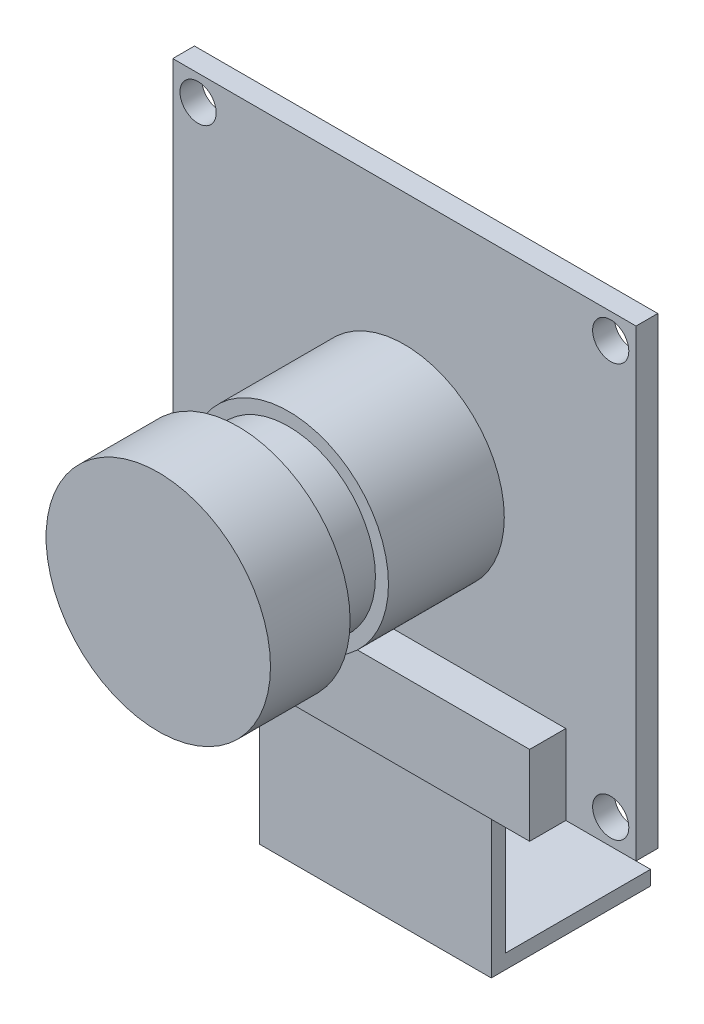
ISO-10303-21;
HEADER;
FILE_DESCRIPTION(('STEP AP214'),'2;1');
FILE_NAME('part.step','',(''),(''),'','','');
FILE_SCHEMA(('AUTOMOTIVE_DESIGN { 1 0 10303 214 1 1 1 1 }'));
ENDSEC;
DATA;
#1=APPLICATION_CONTEXT('core data for automotive mechanical design processes');
#2=APPLICATION_PROTOCOL_DEFINITION('international standard','automotive_design',2000,#1);
#3=PRODUCT_CONTEXT('',#1,'mechanical');
#4=PRODUCT('Part','Part','',(#3));
#5=PRODUCT_RELATED_PRODUCT_CATEGORY('part','',(#4));
#6=PRODUCT_DEFINITION_FORMATION('','',#4);
#7=PRODUCT_DEFINITION_CONTEXT('part definition',#1,'design');
#8=PRODUCT_DEFINITION('design','',#6,#7);
#9=PRODUCT_DEFINITION_SHAPE('','',#8);
#10=(LENGTH_UNIT() NAMED_UNIT(*) SI_UNIT(.MILLI.,.METRE.));
#11=(NAMED_UNIT(*) PLANE_ANGLE_UNIT() SI_UNIT($,.RADIAN.));
#12=(NAMED_UNIT(*) SI_UNIT($,.STERADIAN.) SOLID_ANGLE_UNIT());
#13=UNCERTAINTY_MEASURE_WITH_UNIT(LENGTH_MEASURE(1.E-05),#10,'distance_accuracy_value','');
#14=(GEOMETRIC_REPRESENTATION_CONTEXT(3) GLOBAL_UNCERTAINTY_ASSIGNED_CONTEXT((#13)) GLOBAL_UNIT_ASSIGNED_CONTEXT((#10,
#11,#12)) REPRESENTATION_CONTEXT('',''));
#15=CARTESIAN_POINT('',(0.,0.,0.));
#16=DIRECTION('',(0.,0.,1.));
#17=DIRECTION('',(1.,0.,0.));
#18=AXIS2_PLACEMENT_3D('',#15,#16,#17);
#19=CARTESIAN_POINT('',(0.,0.,1.5));
#20=DIRECTION('',(0.,0.,1.));
#21=DIRECTION('',(1.,0.,0.));
#22=AXIS2_PLACEMENT_3D('',#19,#20,#21);
#23=PLANE('',#22);
#24=CARTESIAN_POINT('',(0.,0.,1.5));
#25=DIRECTION('',(0.,0.,1.));
#26=DIRECTION('',(1.,0.,0.));
#27=AXIS2_PLACEMENT_3D('',#24,#25,#26);
#28=CIRCLE('',#27,6.9);
#29=CARTESIAN_POINT('',(6.9,0.,1.5));
#30=VERTEX_POINT('',#29);
#31=EDGE_CURVE('E229',#30,#30,#28,.T.);
#32=ORIENTED_EDGE('',*,*,#31,.F.);
#33=EDGE_LOOP('',(#32));
#34=FACE_BOUND('',#33,.T.);
#35=CARTESIAN_POINT('',(14.25,14.25,1.5));
#36=DIRECTION('',(0.,0.,1.));
#37=DIRECTION('',(1.,0.,0.));
#38=AXIS2_PLACEMENT_3D('',#35,#36,#37);
#39=CIRCLE('',#38,1.25);
#40=CARTESIAN_POINT('',(15.5,14.25,1.5));
#41=VERTEX_POINT('',#40);
#42=EDGE_CURVE('E282',#41,#41,#39,.T.);
#43=ORIENTED_EDGE('',*,*,#42,.F.);
#44=EDGE_LOOP('',(#43));
#45=FACE_BOUND('',#44,.T.);
#46=CARTESIAN_POINT('',(14.25,-14.25,1.5));
#47=DIRECTION('',(0.,0.,1.));
#48=DIRECTION('',(1.,0.,0.));
#49=AXIS2_PLACEMENT_3D('',#46,#47,#48);
#50=CIRCLE('',#49,1.25000000000003);
#51=CARTESIAN_POINT('',(15.5,-14.25,1.5));
#52=VERTEX_POINT('',#51);
#53=EDGE_CURVE('E285',#52,#52,#50,.T.);
#54=ORIENTED_EDGE('',*,*,#53,.F.);
#55=EDGE_LOOP('',(#54));
#56=FACE_BOUND('',#55,.T.);
#57=CARTESIAN_POINT('',(-14.25,-14.25,1.5));
#58=DIRECTION('',(0.,0.,1.));
#59=DIRECTION('',(1.,0.,0.));
#60=AXIS2_PLACEMENT_3D('',#57,#58,#59);
#61=CIRCLE('',#60,1.25000000000007);
#62=CARTESIAN_POINT('',(-12.9999999999999,-14.25,1.5));
#63=VERTEX_POINT('',#62);
#64=EDGE_CURVE('E288',#63,#63,#61,.T.);
#65=ORIENTED_EDGE('',*,*,#64,.F.);
#66=EDGE_LOOP('',(#65));
#67=FACE_BOUND('',#66,.T.);
#68=CARTESIAN_POINT('',(-14.25,14.25,1.5));
#69=DIRECTION('',(0.,0.,1.));
#70=DIRECTION('',(1.,0.,0.));
#71=AXIS2_PLACEMENT_3D('',#68,#69,#70);
#72=CIRCLE('',#71,1.2500000000001);
#73=CARTESIAN_POINT('',(-12.9999999999999,14.25,1.5));
#74=VERTEX_POINT('',#73);
#75=EDGE_CURVE('E291',#74,#74,#72,.T.);
#76=ORIENTED_EDGE('',*,*,#75,.F.);
#77=EDGE_LOOP('',(#76));
#78=FACE_BOUND('',#77,.T.);
#79=DIRECTION('',(1.,0.,0.));
#80=VECTOR('',#79,1.);
#81=CARTESIAN_POINT('',(0.,-16.,1.5));
#82=LINE('',#81,#80);
#83=CARTESIAN_POINT('',(-16.,-16.,1.5));
#84=VERTEX_POINT('',#83);
#85=CARTESIAN_POINT('',(-11.15,-16.,1.5));
#86=VERTEX_POINT('',#85);
#87=EDGE_CURVE('E274',#84,#86,#82,.T.);
#88=ORIENTED_EDGE('',*,*,#87,.T.);
#89=DIRECTION('',(0.,1.,0.));
#90=VECTOR('',#89,1.);
#91=CARTESIAN_POINT('',(-11.15,0.,1.5));
#92=LINE('',#91,#90);
#93=CARTESIAN_POINT('',(-11.15,-10.5,1.5));
#94=VERTEX_POINT('',#93);
#95=EDGE_CURVE('E236',#86,#94,#92,.T.);
#96=ORIENTED_EDGE('',*,*,#95,.T.);
#97=DIRECTION('',(-1.,0.,0.));
#98=VECTOR('',#97,1.);
#99=CARTESIAN_POINT('',(0.,-10.5,1.5));
#100=LINE('',#99,#98);
#101=CARTESIAN_POINT('',(11.15,-10.5,1.5));
#102=VERTEX_POINT('',#101);
#103=EDGE_CURVE('E252',#102,#94,#100,.T.);
#104=ORIENTED_EDGE('',*,*,#103,.F.);
#105=DIRECTION('',(0.,1.,0.));
#106=VECTOR('',#105,1.);
#107=CARTESIAN_POINT('',(11.15,0.,1.5));
#108=LINE('',#107,#106);
#109=CARTESIAN_POINT('',(11.15,-16.,1.5));
#110=VERTEX_POINT('',#109);
#111=EDGE_CURVE('E243',#110,#102,#108,.T.);
#112=ORIENTED_EDGE('',*,*,#111,.F.);
#113=CARTESIAN_POINT('',(16.,-16.,1.5));
#114=VERTEX_POINT('',#113);
#115=EDGE_CURVE('E272',#110,#114,#82,.T.);
#116=ORIENTED_EDGE('',*,*,#115,.T.);
#117=DIRECTION('',(0.,-1.,0.));
#118=VECTOR('',#117,1.);
#119=CARTESIAN_POINT('',(16.,0.,1.5));
#120=LINE('',#119,#118);
#121=CARTESIAN_POINT('',(16.,16.,1.5));
#122=VERTEX_POINT('',#121);
#123=EDGE_CURVE('E276',#122,#114,#120,.T.);
#124=ORIENTED_EDGE('',*,*,#123,.F.);
#125=DIRECTION('',(1.,0.,0.));
#126=VECTOR('',#125,1.);
#127=CARTESIAN_POINT('',(0.,16.,1.5));
#128=LINE('',#127,#126);
#129=CARTESIAN_POINT('',(-16.,16.,1.5));
#130=VERTEX_POINT('',#129);
#131=EDGE_CURVE('E279',#130,#122,#128,.T.);
#132=ORIENTED_EDGE('',*,*,#131,.F.);
#133=DIRECTION('',(0.,-1.,0.));
#134=VECTOR('',#133,1.);
#135=CARTESIAN_POINT('',(-16.,0.,1.5));
#136=LINE('',#135,#134);
#137=EDGE_CURVE('E269',#130,#84,#136,.T.);
#138=ORIENTED_EDGE('',*,*,#137,.T.);
#139=EDGE_LOOP('',(#88,#96,#104,#112,#116,#124,#132,#138));
#140=FACE_BOUND('',#139,.T.);
#141=ADVANCED_FACE('F56',(#34,#45,#56,#67,#78,#140),#23,.T.);
#142=CARTESIAN_POINT('',(-14.25,14.25,1.5));
#143=DIRECTION('',(0.,0.,-1.));
#144=DIRECTION('',(-1.,0.,0.));
#145=AXIS2_PLACEMENT_3D('',#142,#143,#144);
#146=CYLINDRICAL_SURFACE('',#145,1.2500000000001);
#147=ORIENTED_EDGE('',*,*,#75,.T.);
#148=EDGE_LOOP('',(#147));
#149=FACE_BOUND('',#148,.T.);
#150=CARTESIAN_POINT('',(-14.25,14.25,0.));
#151=DIRECTION('',(0.,0.,1.));
#152=DIRECTION('',(1.,0.,0.));
#153=AXIS2_PLACEMENT_3D('',#150,#151,#152);
#154=CIRCLE('',#153,1.2500000000001);
#155=CARTESIAN_POINT('',(-12.9999999999999,14.25,0.));
#156=VERTEX_POINT('',#155);
#157=EDGE_CURVE('E273',#156,#156,#154,.T.);
#158=ORIENTED_EDGE('',*,*,#157,.F.);
#159=EDGE_LOOP('',(#158));
#160=FACE_BOUND('',#159,.T.);
#161=ADVANCED_FACE('F368',(#149,#160),#146,.F.);
#162=CARTESIAN_POINT('',(-14.25,-14.25,1.5));
#163=DIRECTION('',(0.,0.,-1.));
#164=DIRECTION('',(-1.,0.,0.));
#165=AXIS2_PLACEMENT_3D('',#162,#163,#164);
#166=CYLINDRICAL_SURFACE('',#165,1.25000000000007);
#167=ORIENTED_EDGE('',*,*,#64,.T.);
#168=EDGE_LOOP('',(#167));
#169=FACE_BOUND('',#168,.T.);
#170=CARTESIAN_POINT('',(-14.25,-14.25,0.));
#171=DIRECTION('',(0.,0.,1.));
#172=DIRECTION('',(1.,0.,0.));
#173=AXIS2_PLACEMENT_3D('',#170,#171,#172);
#174=CIRCLE('',#173,1.25000000000007);
#175=CARTESIAN_POINT('',(-12.9999999999999,-14.25,0.));
#176=VERTEX_POINT('',#175);
#177=EDGE_CURVE('E312',#176,#176,#174,.T.);
#178=ORIENTED_EDGE('',*,*,#177,.F.);
#179=EDGE_LOOP('',(#178));
#180=FACE_BOUND('',#179,.T.);
#181=ADVANCED_FACE('F374',(#169,#180),#166,.F.);
#182=CARTESIAN_POINT('',(14.25,-14.25,1.5));
#183=DIRECTION('',(0.,0.,-1.));
#184=DIRECTION('',(-1.,0.,0.));
#185=AXIS2_PLACEMENT_3D('',#182,#183,#184);
#186=CYLINDRICAL_SURFACE('',#185,1.25000000000003);
#187=ORIENTED_EDGE('',*,*,#53,.T.);
#188=EDGE_LOOP('',(#187));
#189=FACE_BOUND('',#188,.T.);
#190=CARTESIAN_POINT('',(14.25,-14.25,0.));
#191=DIRECTION('',(0.,0.,1.));
#192=DIRECTION('',(1.,0.,0.));
#193=AXIS2_PLACEMENT_3D('',#190,#191,#192);
#194=CIRCLE('',#193,1.25000000000003);
#195=CARTESIAN_POINT('',(15.5,-14.25,0.));
#196=VERTEX_POINT('',#195);
#197=EDGE_CURVE('E309',#196,#196,#194,.T.);
#198=ORIENTED_EDGE('',*,*,#197,.F.);
#199=EDGE_LOOP('',(#198));
#200=FACE_BOUND('',#199,.T.);
#201=ADVANCED_FACE('F385',(#189,#200),#186,.F.);
#202=CARTESIAN_POINT('',(14.25,14.25,1.5));
#203=DIRECTION('',(0.,0.,-1.));
#204=DIRECTION('',(-1.,0.,0.));
#205=AXIS2_PLACEMENT_3D('',#202,#203,#204);
#206=CYLINDRICAL_SURFACE('',#205,1.25);
#207=ORIENTED_EDGE('',*,*,#42,.T.);
#208=EDGE_LOOP('',(#207));
#209=FACE_BOUND('',#208,.T.);
#210=CARTESIAN_POINT('',(14.25,14.25,0.));
#211=DIRECTION('',(0.,0.,1.));
#212=DIRECTION('',(1.,0.,0.));
#213=AXIS2_PLACEMENT_3D('',#210,#211,#212);
#214=CIRCLE('',#213,1.25);
#215=CARTESIAN_POINT('',(15.5,14.25,0.));
#216=VERTEX_POINT('',#215);
#217=EDGE_CURVE('E306',#216,#216,#214,.T.);
#218=ORIENTED_EDGE('',*,*,#217,.F.);
#219=EDGE_LOOP('',(#218));
#220=FACE_BOUND('',#219,.T.);
#221=ADVANCED_FACE('F389',(#209,#220),#206,.F.);
#222=CARTESIAN_POINT('',(0.,-16.,1.5));
#223=DIRECTION('',(0.,1.,0.));
#224=DIRECTION('',(0.,0.,1.));
#225=AXIS2_PLACEMENT_3D('',#222,#223,#224);
#226=PLANE('',#225);
#227=DIRECTION('',(1.,0.,0.));
#228=VECTOR('',#227,1.);
#229=CARTESIAN_POINT('',(0.,-16.,3.5));
#230=LINE('',#229,#228);
#231=CARTESIAN_POINT('',(-8.,-16.,3.5));
#232=VERTEX_POINT('',#231);
#233=CARTESIAN_POINT('',(8.,-16.,3.5));
#234=VERTEX_POINT('',#233);
#235=EDGE_CURVE('E71',#232,#234,#230,.T.);
#236=ORIENTED_EDGE('',*,*,#235,.T.);
#237=DIRECTION('',(0.,0.,-1.));
#238=VECTOR('',#237,1.);
#239=CARTESIAN_POINT('',(8.,-16.,0.));
#240=LINE('',#239,#238);
#241=CARTESIAN_POINT('',(8.,-16.,2.5));
#242=VERTEX_POINT('',#241);
#243=EDGE_CURVE('E167',#234,#242,#240,.T.);
#244=ORIENTED_EDGE('',*,*,#243,.T.);
#245=DIRECTION('',(1.,0.,0.));
#246=VECTOR('',#245,1.);
#247=CARTESIAN_POINT('',(0.,-16.,2.5));
#248=LINE('',#247,#246);
#249=CARTESIAN_POINT('',(-8.,-16.,2.5));
#250=VERTEX_POINT('',#249);
#251=EDGE_CURVE('E193',#250,#242,#248,.T.);
#252=ORIENTED_EDGE('',*,*,#251,.F.);
#253=DIRECTION('',(0.,0.,-1.));
#254=VECTOR('',#253,1.);
#255=CARTESIAN_POINT('',(-8.,-16.,0.));
#256=LINE('',#255,#254);
#257=EDGE_CURVE('E76',#232,#250,#256,.T.);
#258=ORIENTED_EDGE('',*,*,#257,.F.);
#259=EDGE_LOOP('',(#236,#244,#252,#258));
#260=FACE_BOUND('',#259,.T.);
#261=DIRECTION('',(1.,0.,0.));
#262=VECTOR('',#261,1.);
#263=CARTESIAN_POINT('',(0.,-16.,0.));
#264=LINE('',#263,#262);
#265=CARTESIAN_POINT('',(-16.,-16.,0.));
#266=VERTEX_POINT('',#265);
#267=CARTESIAN_POINT('',(16.,-16.,0.));
#268=VERTEX_POINT('',#267);
#269=EDGE_CURVE('E297',#266,#268,#264,.T.);
#270=ORIENTED_EDGE('',*,*,#269,.T.);
#271=DIRECTION('',(0.,0.,-1.));
#272=VECTOR('',#271,1.);
#273=CARTESIAN_POINT('',(16.,-16.,1.5));
#274=LINE('',#273,#272);
#275=EDGE_CURVE('E320',#114,#268,#274,.T.);
#276=ORIENTED_EDGE('',*,*,#275,.F.);
#277=ORIENTED_EDGE('',*,*,#115,.F.);
#278=DIRECTION('',(0.,0.,-1.));
#279=VECTOR('',#278,1.);
#280=CARTESIAN_POINT('',(11.15,-16.,4.));
#281=LINE('',#280,#279);
#282=CARTESIAN_POINT('',(11.15,-16.,4.));
#283=VERTEX_POINT('',#282);
#284=EDGE_CURVE('E261',#283,#110,#281,.T.);
#285=ORIENTED_EDGE('',*,*,#284,.F.);
#286=DIRECTION('',(-1.,0.,0.));
#287=VECTOR('',#286,1.);
#288=CARTESIAN_POINT('',(0.,-16.,4.));
#289=LINE('',#288,#287);
#290=CARTESIAN_POINT('',(-11.15,-16.,4.));
#291=VERTEX_POINT('',#290);
#292=EDGE_CURVE('E247',#283,#291,#289,.T.);
#293=ORIENTED_EDGE('',*,*,#292,.T.);
#294=DIRECTION('',(0.,0.,-1.));
#295=VECTOR('',#294,1.);
#296=CARTESIAN_POINT('',(-11.15,-16.,4.));
#297=LINE('',#296,#295);
#298=EDGE_CURVE('E257',#291,#86,#297,.T.);
#299=ORIENTED_EDGE('',*,*,#298,.T.);
#300=ORIENTED_EDGE('',*,*,#87,.F.);
#301=DIRECTION('',(0.,0.,-1.));
#302=VECTOR('',#301,1.);
#303=CARTESIAN_POINT('',(-16.,-16.,1.5));
#304=LINE('',#303,#302);
#305=EDGE_CURVE('E232',#84,#266,#304,.T.);
#306=ORIENTED_EDGE('',*,*,#305,.T.);
#307=EDGE_LOOP('',(#270,#276,#277,#285,#293,#299,#300,#306));
#308=FACE_BOUND('',#307,.T.);
#309=ADVANCED_FACE('F324',(#260,#308),#226,.F.);
#310=CARTESIAN_POINT('',(16.,0.,1.5));
#311=DIRECTION('',(1.,0.,0.));
#312=DIRECTION('',(0.,0.,-1.));
#313=AXIS2_PLACEMENT_3D('',#310,#311,#312);
#314=PLANE('',#313);
#315=DIRECTION('',(0.,-1.,0.));
#316=VECTOR('',#315,1.);
#317=CARTESIAN_POINT('',(16.,0.,0.));
#318=LINE('',#317,#316);
#319=CARTESIAN_POINT('',(16.,16.,0.));
#320=VERTEX_POINT('',#319);
#321=EDGE_CURVE('E300',#320,#268,#318,.T.);
#322=ORIENTED_EDGE('',*,*,#321,.F.);
#323=DIRECTION('',(0.,0.,-1.));
#324=VECTOR('',#323,1.);
#325=CARTESIAN_POINT('',(16.,16.,1.5));
#326=LINE('',#325,#324);
#327=EDGE_CURVE('E318',#122,#320,#326,.T.);
#328=ORIENTED_EDGE('',*,*,#327,.F.);
#329=ORIENTED_EDGE('',*,*,#123,.T.);
#330=ORIENTED_EDGE('',*,*,#275,.T.);
#331=EDGE_LOOP('',(#322,#328,#329,#330));
#332=FACE_BOUND('',#331,.T.);
#333=ADVANCED_FACE('F339',(#332),#314,.T.);
#334=CARTESIAN_POINT('',(0.,16.,1.5));
#335=DIRECTION('',(0.,1.,0.));
#336=DIRECTION('',(0.,0.,1.));
#337=AXIS2_PLACEMENT_3D('',#334,#335,#336);
#338=PLANE('',#337);
#339=DIRECTION('',(1.,0.,0.));
#340=VECTOR('',#339,1.);
#341=CARTESIAN_POINT('',(0.,16.,0.));
#342=LINE('',#341,#340);
#343=CARTESIAN_POINT('',(-16.,16.,0.));
#344=VERTEX_POINT('',#343);
#345=EDGE_CURVE('E303',#344,#320,#342,.T.);
#346=ORIENTED_EDGE('',*,*,#345,.F.);
#347=DIRECTION('',(0.,0.,-1.));
#348=VECTOR('',#347,1.);
#349=CARTESIAN_POINT('',(-16.,16.,1.5));
#350=LINE('',#349,#348);
#351=EDGE_CURVE('E294',#130,#344,#350,.T.);
#352=ORIENTED_EDGE('',*,*,#351,.F.);
#353=ORIENTED_EDGE('',*,*,#131,.T.);
#354=ORIENTED_EDGE('',*,*,#327,.T.);
#355=EDGE_LOOP('',(#346,#352,#353,#354));
#356=FACE_BOUND('',#355,.T.);
#357=ADVANCED_FACE('F334',(#356),#338,.T.);
#358=CARTESIAN_POINT('',(-16.,0.,1.5));
#359=DIRECTION('',(1.,0.,0.));
#360=DIRECTION('',(0.,0.,-1.));
#361=AXIS2_PLACEMENT_3D('',#358,#359,#360);
#362=PLANE('',#361);
#363=DIRECTION('',(0.,-1.,0.));
#364=VECTOR('',#363,1.);
#365=CARTESIAN_POINT('',(-16.,0.,0.));
#366=LINE('',#365,#364);
#367=EDGE_CURVE('E260',#344,#266,#366,.T.);
#368=ORIENTED_EDGE('',*,*,#367,.T.);
#369=ORIENTED_EDGE('',*,*,#305,.F.);
#370=ORIENTED_EDGE('',*,*,#137,.F.);
#371=ORIENTED_EDGE('',*,*,#351,.T.);
#372=EDGE_LOOP('',(#368,#369,#370,#371));
#373=FACE_BOUND('',#372,.T.);
#374=ADVANCED_FACE('F58',(#373),#362,.F.);
#375=CARTESIAN_POINT('',(0.,0.,0.));
#376=DIRECTION('',(0.,0.,1.));
#377=DIRECTION('',(1.,0.,0.));
#378=AXIS2_PLACEMENT_3D('',#375,#376,#377);
#379=PLANE('',#378);
#380=CARTESIAN_POINT('',(-9.50000000000001,0.,0.));
#381=DIRECTION('',(0.,0.,1.));
#382=DIRECTION('',(1.,0.,0.));
#383=AXIS2_PLACEMENT_3D('',#380,#381,#382);
#384=CIRCLE('',#383,1.5);
#385=CARTESIAN_POINT('',(-8.00000000000001,0.,0.));
#386=VERTEX_POINT('',#385);
#387=EDGE_CURVE('E12',#386,#386,#384,.F.);
#388=ORIENTED_EDGE('',*,*,#387,.F.);
#389=EDGE_LOOP('',(#388));
#390=FACE_BOUND('',#389,.T.);
#391=CARTESIAN_POINT('',(9.50000000000001,0.,0.));
#392=DIRECTION('',(0.,0.,1.));
#393=DIRECTION('',(1.,0.,0.));
#394=AXIS2_PLACEMENT_3D('',#391,#392,#393);
#395=CIRCLE('',#394,1.5);
#396=CARTESIAN_POINT('',(11.,0.,0.));
#397=VERTEX_POINT('',#396);
#398=EDGE_CURVE('E214',#397,#397,#395,.T.);
#399=ORIENTED_EDGE('',*,*,#398,.T.);
#400=EDGE_LOOP('',(#399));
#401=FACE_BOUND('',#400,.T.);
#402=ORIENTED_EDGE('',*,*,#367,.F.);
#403=ORIENTED_EDGE('',*,*,#345,.T.);
#404=ORIENTED_EDGE('',*,*,#321,.T.);
#405=ORIENTED_EDGE('',*,*,#269,.F.);
#406=EDGE_LOOP('',(#402,#403,#404,#405));
#407=FACE_BOUND('',#406,.T.);
#408=ORIENTED_EDGE('',*,*,#217,.T.);
#409=EDGE_LOOP('',(#408));
#410=FACE_BOUND('',#409,.T.);
#411=ORIENTED_EDGE('',*,*,#197,.T.);
#412=EDGE_LOOP('',(#411));
#413=FACE_BOUND('',#412,.T.);
#414=ORIENTED_EDGE('',*,*,#177,.T.);
#415=EDGE_LOOP('',(#414));
#416=FACE_BOUND('',#415,.T.);
#417=ORIENTED_EDGE('',*,*,#157,.T.);
#418=EDGE_LOOP('',(#417));
#419=FACE_BOUND('',#418,.T.);
#420=ADVANCED_FACE('F331',(#390,#401,#407,#410,#413,#416,#419),#379,.F.);
#421=CARTESIAN_POINT('',(-11.15,0.,4.));
#422=DIRECTION('',(-1.,0.,0.));
#423=DIRECTION('',(0.,0.,1.));
#424=AXIS2_PLACEMENT_3D('',#421,#422,#423);
#425=PLANE('',#424);
#426=ORIENTED_EDGE('',*,*,#95,.F.);
#427=ORIENTED_EDGE('',*,*,#298,.F.);
#428=DIRECTION('',(0.,1.,0.));
#429=VECTOR('',#428,1.);
#430=CARTESIAN_POINT('',(-11.15,0.,4.));
#431=LINE('',#430,#429);
#432=CARTESIAN_POINT('',(-11.15,-10.5,4.));
#433=VERTEX_POINT('',#432);
#434=EDGE_CURVE('E239',#291,#433,#431,.T.);
#435=ORIENTED_EDGE('',*,*,#434,.T.);
#436=DIRECTION('',(0.,0.,-1.));
#437=VECTOR('',#436,1.);
#438=CARTESIAN_POINT('',(-11.15,-10.5,4.));
#439=LINE('',#438,#437);
#440=EDGE_CURVE('E250',#433,#94,#439,.T.);
#441=ORIENTED_EDGE('',*,*,#440,.T.);
#442=EDGE_LOOP('',(#426,#427,#435,#441));
#443=FACE_BOUND('',#442,.T.);
#444=ADVANCED_FACE('F353',(#443),#425,.T.);
#445=CARTESIAN_POINT('',(11.15,0.,4.));
#446=DIRECTION('',(-1.,0.,0.));
#447=DIRECTION('',(0.,0.,1.));
#448=AXIS2_PLACEMENT_3D('',#445,#446,#447);
#449=PLANE('',#448);
#450=ORIENTED_EDGE('',*,*,#111,.T.);
#451=DIRECTION('',(0.,0.,-1.));
#452=VECTOR('',#451,1.);
#453=CARTESIAN_POINT('',(11.15,-10.5,4.));
#454=LINE('',#453,#452);
#455=CARTESIAN_POINT('',(11.15,-10.5,4.));
#456=VERTEX_POINT('',#455);
#457=EDGE_CURVE('E264',#456,#102,#454,.T.);
#458=ORIENTED_EDGE('',*,*,#457,.F.);
#459=DIRECTION('',(0.,1.,0.));
#460=VECTOR('',#459,1.);
#461=CARTESIAN_POINT('',(11.15,0.,4.));
#462=LINE('',#461,#460);
#463=EDGE_CURVE('E245',#283,#456,#462,.T.);
#464=ORIENTED_EDGE('',*,*,#463,.F.);
#465=ORIENTED_EDGE('',*,*,#284,.T.);
#466=EDGE_LOOP('',(#450,#458,#464,#465));
#467=FACE_BOUND('',#466,.T.);
#468=ADVANCED_FACE('F344',(#467),#449,.F.);
#469=CARTESIAN_POINT('',(0.,-10.5,4.));
#470=DIRECTION('',(0.,-1.,0.));
#471=DIRECTION('',(0.,0.,-1.));
#472=AXIS2_PLACEMENT_3D('',#469,#470,#471);
#473=PLANE('',#472);
#474=ORIENTED_EDGE('',*,*,#103,.T.);
#475=ORIENTED_EDGE('',*,*,#440,.F.);
#476=DIRECTION('',(-1.,0.,0.));
#477=VECTOR('',#476,1.);
#478=CARTESIAN_POINT('',(0.,-10.5,4.));
#479=LINE('',#478,#477);
#480=EDGE_CURVE('E242',#456,#433,#479,.T.);
#481=ORIENTED_EDGE('',*,*,#480,.F.);
#482=ORIENTED_EDGE('',*,*,#457,.T.);
#483=EDGE_LOOP('',(#474,#475,#481,#482));
#484=FACE_BOUND('',#483,.T.);
#485=ADVANCED_FACE('F356',(#484),#473,.F.);
#486=CARTESIAN_POINT('',(0.,0.,4.));
#487=DIRECTION('',(0.,0.,1.));
#488=DIRECTION('',(1.,0.,0.));
#489=AXIS2_PLACEMENT_3D('',#486,#487,#488);
#490=PLANE('',#489);
#491=ORIENTED_EDGE('',*,*,#434,.F.);
#492=ORIENTED_EDGE('',*,*,#292,.F.);
#493=ORIENTED_EDGE('',*,*,#463,.T.);
#494=ORIENTED_EDGE('',*,*,#480,.T.);
#495=EDGE_LOOP('',(#491,#492,#493,#494));
#496=FACE_BOUND('',#495,.T.);
#497=ADVANCED_FACE('F350',(#496),#490,.T.);
#498=CARTESIAN_POINT('',(0.,0.,9.5));
#499=DIRECTION('',(0.,0.,-1.));
#500=DIRECTION('',(-1.,0.,0.));
#501=AXIS2_PLACEMENT_3D('',#498,#499,#500);
#502=CYLINDRICAL_SURFACE('',#501,6.9);
#503=CARTESIAN_POINT('',(0.,0.,9.5));
#504=DIRECTION('',(0.,0.,1.));
#505=DIRECTION('',(1.,0.,0.));
#506=AXIS2_PLACEMENT_3D('',#503,#504,#505);
#507=CIRCLE('',#506,6.9);
#508=CARTESIAN_POINT('',(6.9,0.,9.5));
#509=VERTEX_POINT('',#508);
#510=EDGE_CURVE('E233',#509,#509,#507,.T.);
#511=ORIENTED_EDGE('',*,*,#510,.F.);
#512=EDGE_LOOP('',(#511));
#513=FACE_BOUND('',#512,.T.);
#514=ORIENTED_EDGE('',*,*,#31,.T.);
#515=EDGE_LOOP('',(#514));
#516=FACE_BOUND('',#515,.T.);
#517=ADVANCED_FACE('F363',(#513,#516),#502,.T.);
#518=CARTESIAN_POINT('',(0.,0.,9.5));
#519=DIRECTION('',(0.,0.,1.));
#520=DIRECTION('',(1.,0.,0.));
#521=AXIS2_PLACEMENT_3D('',#518,#519,#520);
#522=PLANE('',#521);
#523=CARTESIAN_POINT('',(0.,0.,9.5));
#524=DIRECTION('',(0.,0.,1.));
#525=DIRECTION('',(1.,0.,0.));
#526=AXIS2_PLACEMENT_3D('',#523,#524,#525);
#527=CIRCLE('',#526,6.);
#528=CARTESIAN_POINT('',(6.,0.,9.5));
#529=VERTEX_POINT('',#528);
#530=EDGE_CURVE('E64',#529,#529,#527,.T.);
#531=ORIENTED_EDGE('',*,*,#530,.F.);
#532=EDGE_LOOP('',(#531));
#533=FACE_BOUND('',#532,.T.);
#534=ORIENTED_EDGE('',*,*,#510,.T.);
#535=EDGE_LOOP('',(#534));
#536=FACE_BOUND('',#535,.T.);
#537=ADVANCED_FACE('F461',(#533,#536),#522,.T.);
#538=CARTESIAN_POINT('',(0.,0.,13.));
#539=DIRECTION('',(0.,0.,-1.));
#540=DIRECTION('',(-1.,0.,0.));
#541=AXIS2_PLACEMENT_3D('',#538,#539,#540);
#542=CYLINDRICAL_SURFACE('',#541,6.);
#543=CARTESIAN_POINT('',(0.,0.,13.));
#544=DIRECTION('',(0.,0.,1.));
#545=DIRECTION('',(1.,0.,0.));
#546=AXIS2_PLACEMENT_3D('',#543,#544,#545);
#547=CIRCLE('',#546,6.);
#548=CARTESIAN_POINT('',(6.,0.,13.));
#549=VERTEX_POINT('',#548);
#550=EDGE_CURVE('E224',#549,#549,#547,.T.);
#551=ORIENTED_EDGE('',*,*,#550,.F.);
#552=EDGE_LOOP('',(#551));
#553=FACE_BOUND('',#552,.T.);
#554=ORIENTED_EDGE('',*,*,#530,.T.);
#555=EDGE_LOOP('',(#554));
#556=FACE_BOUND('',#555,.T.);
#557=ADVANCED_FACE('F472',(#553,#556),#542,.T.);
#558=CARTESIAN_POINT('',(0.,0.,18.5));
#559=DIRECTION('',(0.,0.,-1.));
#560=DIRECTION('',(-1.,0.,0.));
#561=AXIS2_PLACEMENT_3D('',#558,#559,#560);
#562=CYLINDRICAL_SURFACE('',#561,7.75);
#563=CARTESIAN_POINT('',(0.,0.,18.5));
#564=DIRECTION('',(0.,0.,1.));
#565=DIRECTION('',(1.,0.,0.));
#566=AXIS2_PLACEMENT_3D('',#563,#564,#565);
#567=CIRCLE('',#566,7.75);
#568=CARTESIAN_POINT('',(7.75,0.,18.5));
#569=VERTEX_POINT('',#568);
#570=EDGE_CURVE('E221',#569,#569,#567,.T.);
#571=ORIENTED_EDGE('',*,*,#570,.F.);
#572=EDGE_LOOP('',(#571));
#573=FACE_BOUND('',#572,.T.);
#574=CARTESIAN_POINT('',(0.,0.,13.));
#575=DIRECTION('',(0.,0.,1.));
#576=DIRECTION('',(1.,0.,0.));
#577=AXIS2_PLACEMENT_3D('',#574,#575,#576);
#578=CIRCLE('',#577,7.75);
#579=CARTESIAN_POINT('',(7.75,0.,13.));
#580=VERTEX_POINT('',#579);
#581=EDGE_CURVE('E218',#580,#580,#578,.T.);
#582=ORIENTED_EDGE('',*,*,#581,.T.);
#583=EDGE_LOOP('',(#582));
#584=FACE_BOUND('',#583,.T.);
#585=ADVANCED_FACE('F483',(#573,#584),#562,.T.);
#586=CARTESIAN_POINT('',(0.,0.,18.5));
#587=DIRECTION('',(0.,0.,1.));
#588=DIRECTION('',(1.,0.,0.));
#589=AXIS2_PLACEMENT_3D('',#586,#587,#588);
#590=PLANE('',#589);
#591=ORIENTED_EDGE('',*,*,#570,.T.);
#592=EDGE_LOOP('',(#591));
#593=FACE_BOUND('',#592,.T.);
#594=ADVANCED_FACE('F494',(#593),#590,.T.);
#595=CARTESIAN_POINT('',(0.,0.,13.));
#596=DIRECTION('',(0.,0.,1.));
#597=DIRECTION('',(1.,0.,0.));
#598=AXIS2_PLACEMENT_3D('',#595,#596,#597);
#599=PLANE('',#598);
#600=ORIENTED_EDGE('',*,*,#550,.T.);
#601=EDGE_LOOP('',(#600));
#602=FACE_BOUND('',#601,.T.);
#603=ORIENTED_EDGE('',*,*,#581,.F.);
#604=EDGE_LOOP('',(#603));
#605=FACE_BOUND('',#604,.T.);
#606=ADVANCED_FACE('F504',(#602,#605),#599,.F.);
#607=CARTESIAN_POINT('',(9.50000000000001,0.,-0.5));
#608=DIRECTION('',(0.,0.,1.));
#609=DIRECTION('',(1.,0.,0.));
#610=AXIS2_PLACEMENT_3D('',#607,#608,#609);
#611=CYLINDRICAL_SURFACE('',#610,1.5);
#612=CARTESIAN_POINT('',(9.50000000000001,0.,-0.5));
#613=DIRECTION('',(0.,0.,1.));
#614=DIRECTION('',(1.,0.,0.));
#615=AXIS2_PLACEMENT_3D('',#612,#613,#614);
#616=CIRCLE('',#615,1.5);
#617=CARTESIAN_POINT('',(11.,0.,-0.5));
#618=VERTEX_POINT('',#617);
#619=EDGE_CURVE('E215',#618,#618,#616,.T.);
#620=ORIENTED_EDGE('',*,*,#619,.T.);
#621=EDGE_LOOP('',(#620));
#622=FACE_BOUND('',#621,.T.);
#623=ORIENTED_EDGE('',*,*,#398,.F.);
#624=EDGE_LOOP('',(#623));
#625=FACE_BOUND('',#624,.T.);
#626=ADVANCED_FACE('F513',(#622,#625),#611,.T.);
#627=CARTESIAN_POINT('',(0.,0.,-0.5));
#628=DIRECTION('',(0.,0.,1.));
#629=DIRECTION('',(1.,0.,0.));
#630=AXIS2_PLACEMENT_3D('',#627,#628,#629);
#631=PLANE('',#630);
#632=ORIENTED_EDGE('',*,*,#619,.F.);
#633=EDGE_LOOP('',(#632));
#634=FACE_BOUND('',#633,.T.);
#635=ADVANCED_FACE('F525',(#634),#631,.F.);
#636=CARTESIAN_POINT('',(-9.50000000000001,0.,-0.5));
#637=DIRECTION('',(0.,0.,1.));
#638=DIRECTION('',(1.,0.,0.));
#639=AXIS2_PLACEMENT_3D('',#636,#637,#638);
#640=CYLINDRICAL_SURFACE('',#639,1.5);
#641=CARTESIAN_POINT('',(-9.50000000000001,0.,-0.5));
#642=DIRECTION('',(0.,0.,1.));
#643=DIRECTION('',(1.,0.,0.));
#644=AXIS2_PLACEMENT_3D('',#641,#642,#643);
#645=CIRCLE('',#644,1.5);
#646=CARTESIAN_POINT('',(-8.00000000000001,0.,-0.5));
#647=VERTEX_POINT('',#646);
#648=EDGE_CURVE('E211',#647,#647,#645,.F.);
#649=ORIENTED_EDGE('',*,*,#648,.F.);
#650=EDGE_LOOP('',(#649));
#651=FACE_BOUND('',#650,.T.);
#652=ORIENTED_EDGE('',*,*,#387,.T.);
#653=EDGE_LOOP('',(#652));
#654=FACE_BOUND('',#653,.T.);
#655=ADVANCED_FACE('F534',(#651,#654),#640,.T.);
#656=CARTESIAN_POINT('',(0.,0.,-0.5));
#657=DIRECTION('',(0.,0.,1.));
#658=DIRECTION('',(1.,0.,0.));
#659=AXIS2_PLACEMENT_3D('',#656,#657,#658);
#660=PLANE('',#659);
#661=ORIENTED_EDGE('',*,*,#648,.T.);
#662=EDGE_LOOP('',(#661));
#663=FACE_BOUND('',#662,.T.);
#664=ADVANCED_FACE('F542',(#663),#660,.F.);
#665=CARTESIAN_POINT('',(8.,-26.,0.));
#666=DIRECTION('',(1.,0.,0.));
#667=DIRECTION('',(0.,0.,-1.));
#668=AXIS2_PLACEMENT_3D('',#665,#666,#667);
#669=PLANE('',#668);
#670=ORIENTED_EDGE('',*,*,#243,.F.);
#671=DIRECTION('',(0.,1.,0.));
#672=VECTOR('',#671,1.);
#673=CARTESIAN_POINT('',(8.,-26.,3.5));
#674=LINE('',#673,#672);
#675=CARTESIAN_POINT('',(8.,-26.,3.5));
#676=VERTEX_POINT('',#675);
#677=EDGE_CURVE('E209',#676,#234,#674,.T.);
#678=ORIENTED_EDGE('',*,*,#677,.F.);
#679=DIRECTION('',(0.,0.,-1.));
#680=VECTOR('',#679,1.);
#681=CARTESIAN_POINT('',(8.,-26.,0.));
#682=LINE('',#681,#680);
#683=CARTESIAN_POINT('',(8.,-26.,-7.5));
#684=VERTEX_POINT('',#683);
#685=EDGE_CURVE('E175',#676,#684,#682,.T.);
#686=ORIENTED_EDGE('',*,*,#685,.T.);
#687=DIRECTION('',(0.,-1.,0.));
#688=VECTOR('',#687,1.);
#689=CARTESIAN_POINT('',(8.,0.,-7.5));
#690=LINE('',#689,#688);
#691=CARTESIAN_POINT('',(8.,-25.,-7.5));
#692=VERTEX_POINT('',#691);
#693=EDGE_CURVE('E171',#692,#684,#690,.T.);
#694=ORIENTED_EDGE('',*,*,#693,.F.);
#695=DIRECTION('',(0.,0.,1.));
#696=VECTOR('',#695,1.);
#697=CARTESIAN_POINT('',(8.,-25.,-7.5));
#698=LINE('',#697,#696);
#699=CARTESIAN_POINT('',(8.,-25.,2.5));
#700=VERTEX_POINT('',#699);
#701=EDGE_CURVE('E158',#692,#700,#698,.T.);
#702=ORIENTED_EDGE('',*,*,#701,.T.);
#703=DIRECTION('',(0.,1.,0.));
#704=VECTOR('',#703,1.);
#705=CARTESIAN_POINT('',(8.,-26.,2.5));
#706=LINE('',#705,#704);
#707=EDGE_CURVE('E198',#700,#242,#706,.T.);
#708=ORIENTED_EDGE('',*,*,#707,.T.);
#709=EDGE_LOOP('',(#670,#678,#686,#694,#702,#708));
#710=FACE_BOUND('',#709,.T.);
#711=ADVANCED_FACE('F173',(#710),#669,.T.);
#712=CARTESIAN_POINT('',(0.,-26.,3.5));
#713=DIRECTION('',(0.,0.,1.));
#714=DIRECTION('',(1.,0.,0.));
#715=AXIS2_PLACEMENT_3D('',#712,#713,#714);
#716=PLANE('',#715);
#717=ORIENTED_EDGE('',*,*,#235,.F.);
#718=DIRECTION('',(0.,1.,0.));
#719=VECTOR('',#718,1.);
#720=CARTESIAN_POINT('',(-8.,-26.,3.5));
#721=LINE('',#720,#719);
#722=CARTESIAN_POINT('',(-8.,-26.,3.5));
#723=VERTEX_POINT('',#722);
#724=EDGE_CURVE('E207',#723,#232,#721,.T.);
#725=ORIENTED_EDGE('',*,*,#724,.F.);
#726=DIRECTION('',(1.,0.,0.));
#727=VECTOR('',#726,1.);
#728=CARTESIAN_POINT('',(0.,-26.,3.5));
#729=LINE('',#728,#727);
#730=EDGE_CURVE('E192',#723,#676,#729,.T.);
#731=ORIENTED_EDGE('',*,*,#730,.T.);
#732=ORIENTED_EDGE('',*,*,#677,.T.);
#733=EDGE_LOOP('',(#717,#725,#731,#732));
#734=FACE_BOUND('',#733,.T.);
#735=ADVANCED_FACE('F569',(#734),#716,.T.);
#736=CARTESIAN_POINT('',(-8.,-26.,0.));
#737=DIRECTION('',(1.,0.,0.));
#738=DIRECTION('',(0.,0.,-1.));
#739=AXIS2_PLACEMENT_3D('',#736,#737,#738);
#740=PLANE('',#739);
#741=ORIENTED_EDGE('',*,*,#257,.T.);
#742=DIRECTION('',(0.,1.,0.));
#743=VECTOR('',#742,1.);
#744=CARTESIAN_POINT('',(-8.,-26.,2.5));
#745=LINE('',#744,#743);
#746=CARTESIAN_POINT('',(-8.,-25.,2.5));
#747=VERTEX_POINT('',#746);
#748=EDGE_CURVE('E205',#747,#250,#745,.T.);
#749=ORIENTED_EDGE('',*,*,#748,.F.);
#750=DIRECTION('',(0.,0.,1.));
#751=VECTOR('',#750,1.);
#752=CARTESIAN_POINT('',(-8.,-25.,-7.5));
#753=LINE('',#752,#751);
#754=CARTESIAN_POINT('',(-8.,-25.,-7.5));
#755=VERTEX_POINT('',#754);
#756=EDGE_CURVE('E168',#755,#747,#753,.T.);
#757=ORIENTED_EDGE('',*,*,#756,.F.);
#758=DIRECTION('',(0.,1.,0.));
#759=VECTOR('',#758,1.);
#760=CARTESIAN_POINT('',(-8.,0.,-7.5));
#761=LINE('',#760,#759);
#762=CARTESIAN_POINT('',(-8.,-26.,-7.5));
#763=VERTEX_POINT('',#762);
#764=EDGE_CURVE('E183',#763,#755,#761,.T.);
#765=ORIENTED_EDGE('',*,*,#764,.F.);
#766=DIRECTION('',(0.,0.,-1.));
#767=VECTOR('',#766,1.);
#768=CARTESIAN_POINT('',(-8.,-26.,0.));
#769=LINE('',#768,#767);
#770=EDGE_CURVE('E196',#723,#763,#769,.T.);
#771=ORIENTED_EDGE('',*,*,#770,.F.);
#772=ORIENTED_EDGE('',*,*,#724,.T.);
#773=EDGE_LOOP('',(#741,#749,#757,#765,#771,#772));
#774=FACE_BOUND('',#773,.T.);
#775=ADVANCED_FACE('F580',(#774),#740,.F.);
#776=CARTESIAN_POINT('',(0.,-26.,2.5));
#777=DIRECTION('',(0.,0.,1.));
#778=DIRECTION('',(1.,0.,0.));
#779=AXIS2_PLACEMENT_3D('',#776,#777,#778);
#780=PLANE('',#779);
#781=ORIENTED_EDGE('',*,*,#707,.F.);
#782=DIRECTION('',(-1.,0.,0.));
#783=VECTOR('',#782,1.);
#784=CARTESIAN_POINT('',(0.,-25.,2.5));
#785=LINE('',#784,#783);
#786=EDGE_CURVE('E164',#700,#747,#785,.T.);
#787=ORIENTED_EDGE('',*,*,#786,.T.);
#788=ORIENTED_EDGE('',*,*,#748,.T.);
#789=ORIENTED_EDGE('',*,*,#251,.T.);
#790=EDGE_LOOP('',(#781,#787,#788,#789));
#791=FACE_BOUND('',#790,.T.);
#792=ADVANCED_FACE('F590',(#791),#780,.F.);
#793=CARTESIAN_POINT('',(0.,-26.,0.));
#794=DIRECTION('',(0.,-1.,0.));
#795=DIRECTION('',(0.,0.,-1.));
#796=AXIS2_PLACEMENT_3D('',#793,#794,#795);
#797=PLANE('',#796);
#798=ORIENTED_EDGE('',*,*,#685,.F.);
#799=ORIENTED_EDGE('',*,*,#730,.F.);
#800=ORIENTED_EDGE('',*,*,#770,.T.);
#801=DIRECTION('',(-1.,0.,0.));
#802=VECTOR('',#801,1.);
#803=CARTESIAN_POINT('',(0.,-26.,-7.5));
#804=LINE('',#803,#802);
#805=EDGE_CURVE('E179',#684,#763,#804,.T.);
#806=ORIENTED_EDGE('',*,*,#805,.F.);
#807=EDGE_LOOP('',(#798,#799,#800,#806));
#808=FACE_BOUND('',#807,.T.);
#809=ADVANCED_FACE('F600',(#808),#797,.T.);
#810=CARTESIAN_POINT('',(0.,-25.,-7.5));
#811=DIRECTION('',(0.,1.,0.));
#812=DIRECTION('',(0.,0.,1.));
#813=AXIS2_PLACEMENT_3D('',#810,#811,#812);
#814=PLANE('',#813);
#815=ORIENTED_EDGE('',*,*,#786,.F.);
#816=ORIENTED_EDGE('',*,*,#701,.F.);
#817=DIRECTION('',(-1.,0.,0.));
#818=VECTOR('',#817,1.);
#819=CARTESIAN_POINT('',(0.,-25.,-7.5));
#820=LINE('',#819,#818);
#821=EDGE_CURVE('E162',#692,#755,#820,.T.);
#822=ORIENTED_EDGE('',*,*,#821,.T.);
#823=ORIENTED_EDGE('',*,*,#756,.T.);
#824=EDGE_LOOP('',(#815,#816,#822,#823));
#825=FACE_BOUND('',#824,.T.);
#826=ADVANCED_FACE('F160',(#825),#814,.T.);
#827=CARTESIAN_POINT('',(0.,0.,-7.5));
#828=DIRECTION('',(0.,0.,-1.));
#829=DIRECTION('',(-1.,0.,0.));
#830=AXIS2_PLACEMENT_3D('',#827,#828,#829);
#831=PLANE('',#830);
#832=ORIENTED_EDGE('',*,*,#821,.F.);
#833=ORIENTED_EDGE('',*,*,#693,.T.);
#834=ORIENTED_EDGE('',*,*,#805,.T.);
#835=ORIENTED_EDGE('',*,*,#764,.T.);
#836=EDGE_LOOP('',(#832,#833,#834,#835));
#837=FACE_BOUND('',#836,.T.);
#838=ADVANCED_FACE('F181',(#837),#831,.T.);
#839=CLOSED_SHELL('',(#141,#161,#181,#201,#221,#309,#333,#357,#374,#420,#444,#468,#485,#497,
#517,#537,#557,#585,#594,#606,#626,#635,#655,#664,#711,#735,#775,#792,#809,#826,#838));
#840=MANIFOLD_SOLID_BREP('B2',#839);
#841=ADVANCED_BREP_SHAPE_REPRESENTATION('',(#18,#840),#14);
#842=SHAPE_DEFINITION_REPRESENTATION(#9,#841);
ENDSEC;
END-ISO-10303-21;
